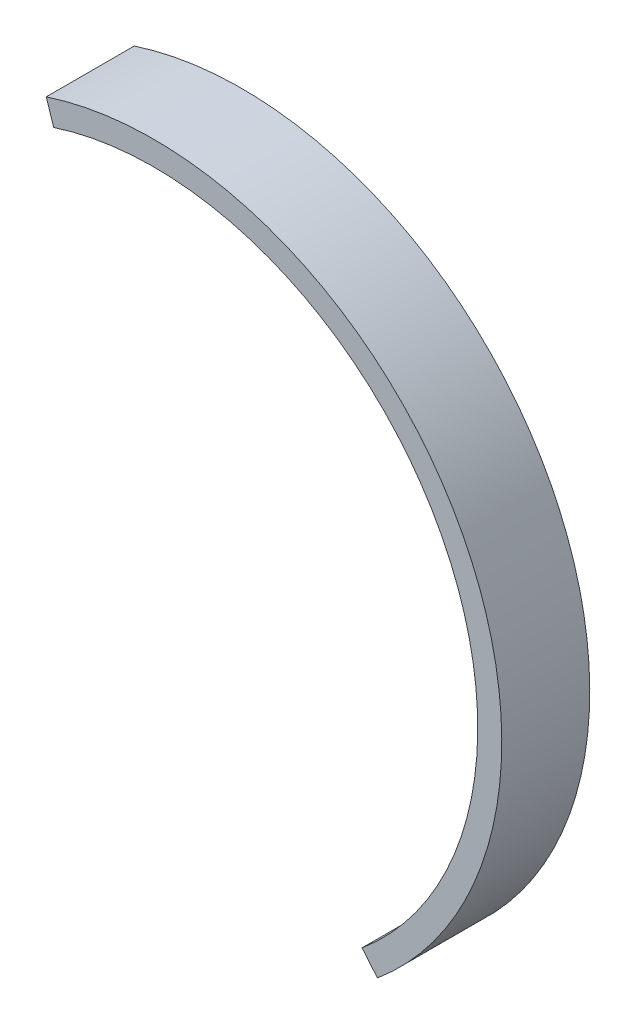
ISO-10303-21;
HEADER;
FILE_DESCRIPTION(('STEP AP214'),'2;1');
FILE_NAME('part.step','',(''),(''),'','','');
FILE_SCHEMA(('AUTOMOTIVE_DESIGN { 1 0 10303 214 1 1 1 1 }'));
ENDSEC;
DATA;
#1=APPLICATION_CONTEXT('core data for automotive mechanical design processes');
#2=APPLICATION_PROTOCOL_DEFINITION('international standard','automotive_design',2000,#1);
#3=PRODUCT_CONTEXT('',#1,'mechanical');
#4=PRODUCT('Part','Part','',(#3));
#5=PRODUCT_RELATED_PRODUCT_CATEGORY('part','',(#4));
#6=PRODUCT_DEFINITION_FORMATION('','',#4);
#7=PRODUCT_DEFINITION_CONTEXT('part definition',#1,'design');
#8=PRODUCT_DEFINITION('design','',#6,#7);
#9=PRODUCT_DEFINITION_SHAPE('','',#8);
#10=(LENGTH_UNIT() NAMED_UNIT(*) SI_UNIT(.MILLI.,.METRE.));
#11=(NAMED_UNIT(*) PLANE_ANGLE_UNIT() SI_UNIT($,.RADIAN.));
#12=(NAMED_UNIT(*) SI_UNIT($,.STERADIAN.) SOLID_ANGLE_UNIT());
#13=UNCERTAINTY_MEASURE_WITH_UNIT(LENGTH_MEASURE(1.E-05),#10,'distance_accuracy_value','');
#14=(GEOMETRIC_REPRESENTATION_CONTEXT(3) GLOBAL_UNCERTAINTY_ASSIGNED_CONTEXT((#13)) GLOBAL_UNIT_ASSIGNED_CONTEXT((#10,
#11,#12)) REPRESENTATION_CONTEXT('',''));
#15=CARTESIAN_POINT('',(0.,0.,0.));
#16=DIRECTION('',(0.,0.,1.));
#17=DIRECTION('',(1.,0.,0.));
#18=AXIS2_PLACEMENT_3D('',#15,#16,#17);
#19=CARTESIAN_POINT('',(0.,0.,22.));
#20=DIRECTION('',(0.,0.,-1.));
#21=DIRECTION('',(-1.,0.,0.));
#22=AXIS2_PLACEMENT_3D('',#19,#20,#21);
#23=CYLINDRICAL_SURFACE('',#22,81.);
#24=CARTESIAN_POINT('',(0.,0.,0.));
#25=DIRECTION('',(0.,0.,-1.));
#26=DIRECTION('',(1.,0.,0.));
#27=AXIS2_PLACEMENT_3D('',#24,#25,#26);
#28=CIRCLE('',#27,81.);
#29=CARTESIAN_POINT('',(-25.0303765443708,77.0355778199074,0.));
#30=VERTEX_POINT('',#29);
#31=CARTESIAN_POINT('',(52.0657963846096,-62.0495998926373,0.));
#32=VERTEX_POINT('',#31);
#33=EDGE_CURVE('E75',#30,#32,#28,.T.);
#34=ORIENTED_EDGE('',*,*,#33,.T.);
#35=DIRECTION('',(0.,0.,-1.));
#36=VECTOR('',#35,1.);
#37=CARTESIAN_POINT('',(52.0657963846096,-62.0495998926373,22.));
#38=LINE('',#37,#36);
#39=CARTESIAN_POINT('',(52.0657963846096,-62.0495998926373,22.));
#40=VERTEX_POINT('',#39);
#41=EDGE_CURVE('E11',#40,#32,#38,.T.);
#42=ORIENTED_EDGE('',*,*,#41,.F.);
#43=CARTESIAN_POINT('',(0.,0.,22.));
#44=DIRECTION('',(0.,0.,-1.));
#45=DIRECTION('',(1.,0.,0.));
#46=AXIS2_PLACEMENT_3D('',#43,#44,#45);
#47=CIRCLE('',#46,81.);
#48=CARTESIAN_POINT('',(-25.0303765443708,77.0355778199075,22.));
#49=VERTEX_POINT('',#48);
#50=EDGE_CURVE('E93',#49,#40,#47,.T.);
#51=ORIENTED_EDGE('',*,*,#50,.F.);
#52=DIRECTION('',(0.,0.,-1.));
#53=VECTOR('',#52,1.);
#54=CARTESIAN_POINT('',(-25.0303765443708,77.0355778199075,22.));
#55=LINE('',#54,#53);
#56=EDGE_CURVE('E87',#49,#30,#55,.T.);
#57=ORIENTED_EDGE('',*,*,#56,.T.);
#58=EDGE_LOOP('',(#34,#42,#51,#57));
#59=FACE_BOUND('',#58,.T.);
#60=ADVANCED_FACE('F31',(#59),#23,.F.);
#61=CARTESIAN_POINT('',(52.0657963846096,-62.0495998926373,22.));
#62=DIRECTION('',(0.766044443118981,0.642787609686538,0.));
#63=DIRECTION('',(-0.642787609686538,0.766044443118979,0.));
#64=AXIS2_PLACEMENT_3D('',#61,#62,#63);
#65=PLANE('',#64);
#66=DIRECTION('',(0.642787609686537,-0.766044443118979,0.));
#67=VECTOR('',#66,1.);
#68=CARTESIAN_POINT('',(52.0657963846096,-62.0495998926373,0.));
#69=LINE('',#68,#67);
#70=CARTESIAN_POINT('',(55.9225220427288,-66.6458665513512,0.));
#71=VERTEX_POINT('',#70);
#72=EDGE_CURVE('E71',#32,#71,#69,.T.);
#73=ORIENTED_EDGE('',*,*,#72,.T.);
#74=DIRECTION('',(0.,0.,-1.));
#75=VECTOR('',#74,1.);
#76=CARTESIAN_POINT('',(55.9225220427288,-66.6458665513511,22.));
#77=LINE('',#76,#75);
#78=CARTESIAN_POINT('',(55.9225220427288,-66.6458665513511,22.));
#79=VERTEX_POINT('',#78);
#80=EDGE_CURVE('E38',#79,#71,#77,.T.);
#81=ORIENTED_EDGE('',*,*,#80,.F.);
#82=DIRECTION('',(0.642787609686537,-0.766044443118979,0.));
#83=VECTOR('',#82,1.);
#84=CARTESIAN_POINT('',(52.0657963846096,-62.0495998926373,22.));
#85=LINE('',#84,#83);
#86=EDGE_CURVE('E83',#40,#79,#85,.T.);
#87=ORIENTED_EDGE('',*,*,#86,.F.);
#88=ORIENTED_EDGE('',*,*,#41,.T.);
#89=EDGE_LOOP('',(#73,#81,#87,#88));
#90=FACE_BOUND('',#89,.T.);
#91=ADVANCED_FACE('F82',(#90),#65,.F.);
#92=CARTESIAN_POINT('',(0.,0.,22.));
#93=DIRECTION('',(0.,0.,-1.));
#94=DIRECTION('',(-1.,0.,0.));
#95=AXIS2_PLACEMENT_3D('',#92,#93,#94);
#96=CYLINDRICAL_SURFACE('',#95,87.);
#97=CARTESIAN_POINT('',(0.,0.,0.));
#98=DIRECTION('',(0.,0.,1.));
#99=DIRECTION('',(1.,0.,0.));
#100=AXIS2_PLACEMENT_3D('',#97,#98,#99);
#101=CIRCLE('',#100,87.);
#102=CARTESIAN_POINT('',(-26.8844785106205,82.7419169176783,0.));
#103=VERTEX_POINT('',#102);
#104=EDGE_CURVE('E76',#71,#103,#101,.T.);
#105=ORIENTED_EDGE('',*,*,#104,.T.);
#106=DIRECTION('',(0.,0.,-1.));
#107=VECTOR('',#106,1.);
#108=CARTESIAN_POINT('',(-26.8844785106205,82.7419169176783,22.));
#109=LINE('',#108,#107);
#110=CARTESIAN_POINT('',(-26.8844785106205,82.7419169176783,22.));
#111=VERTEX_POINT('',#110);
#112=EDGE_CURVE('E99',#111,#103,#109,.T.);
#113=ORIENTED_EDGE('',*,*,#112,.F.);
#114=CARTESIAN_POINT('',(0.,0.,22.));
#115=DIRECTION('',(0.,0.,1.));
#116=DIRECTION('',(1.,0.,0.));
#117=AXIS2_PLACEMENT_3D('',#114,#115,#116);
#118=CIRCLE('',#117,87.);
#119=EDGE_CURVE('E50',#79,#111,#118,.T.);
#120=ORIENTED_EDGE('',*,*,#119,.F.);
#121=ORIENTED_EDGE('',*,*,#80,.T.);
#122=EDGE_LOOP('',(#105,#113,#120,#121));
#123=FACE_BOUND('',#122,.T.);
#124=ADVANCED_FACE('F102',(#123),#96,.T.);
#125=CARTESIAN_POINT('',(-25.0303765443708,77.0355778199075,22.));
#126=DIRECTION('',(0.951056516295156,0.309016994374949,0.));
#127=DIRECTION('',(-0.309016994374948,0.951056516295154,0.));
#128=AXIS2_PLACEMENT_3D('',#125,#126,#127);
#129=PLANE('',#128);
#130=DIRECTION('',(0.309016994374948,-0.951056516295154,0.));
#131=VECTOR('',#130,1.);
#132=CARTESIAN_POINT('',(-25.0303765443708,77.0355778199074,0.));
#133=LINE('',#132,#131);
#134=EDGE_CURVE('E91',#103,#30,#133,.T.);
#135=ORIENTED_EDGE('',*,*,#134,.T.);
#136=ORIENTED_EDGE('',*,*,#56,.F.);
#137=DIRECTION('',(0.309016994374948,-0.951056516295154,0.));
#138=VECTOR('',#137,1.);
#139=CARTESIAN_POINT('',(-25.0303765443708,77.0355778199075,22.));
#140=LINE('',#139,#138);
#141=EDGE_CURVE('E45',#111,#49,#140,.T.);
#142=ORIENTED_EDGE('',*,*,#141,.F.);
#143=ORIENTED_EDGE('',*,*,#112,.T.);
#144=EDGE_LOOP('',(#135,#136,#142,#143));
#145=FACE_BOUND('',#144,.T.);
#146=ADVANCED_FACE('F104',(#145),#129,.F.);
#147=CARTESIAN_POINT('',(0.,0.,22.));
#148=DIRECTION('',(0.,0.,1.));
#149=DIRECTION('',(1.,0.,0.));
#150=AXIS2_PLACEMENT_3D('',#147,#148,#149);
#151=PLANE('',#150);
#152=ORIENTED_EDGE('',*,*,#50,.T.);
#153=ORIENTED_EDGE('',*,*,#86,.T.);
#154=ORIENTED_EDGE('',*,*,#119,.T.);
#155=ORIENTED_EDGE('',*,*,#141,.T.);
#156=EDGE_LOOP('',(#152,#153,#154,#155));
#157=FACE_BOUND('',#156,.T.);
#158=ADVANCED_FACE('F105',(#157),#151,.T.);
#159=CARTESIAN_POINT('',(0.,0.,0.));
#160=DIRECTION('',(0.,0.,1.));
#161=DIRECTION('',(1.,0.,0.));
#162=AXIS2_PLACEMENT_3D('',#159,#160,#161);
#163=PLANE('',#162);
#164=ORIENTED_EDGE('',*,*,#33,.F.);
#165=ORIENTED_EDGE('',*,*,#134,.F.);
#166=ORIENTED_EDGE('',*,*,#104,.F.);
#167=ORIENTED_EDGE('',*,*,#72,.F.);
#168=EDGE_LOOP('',(#164,#165,#166,#167));
#169=FACE_BOUND('',#168,.T.);
#170=ADVANCED_FACE('F72',(#169),#163,.F.);
#171=CLOSED_SHELL('',(#60,#91,#124,#146,#158,#170));
#172=MANIFOLD_SOLID_BREP('B2',#171);
#173=ADVANCED_BREP_SHAPE_REPRESENTATION('',(#18,#172),#14);
#174=SHAPE_DEFINITION_REPRESENTATION(#9,#173);
ENDSEC;
END-ISO-10303-21;
